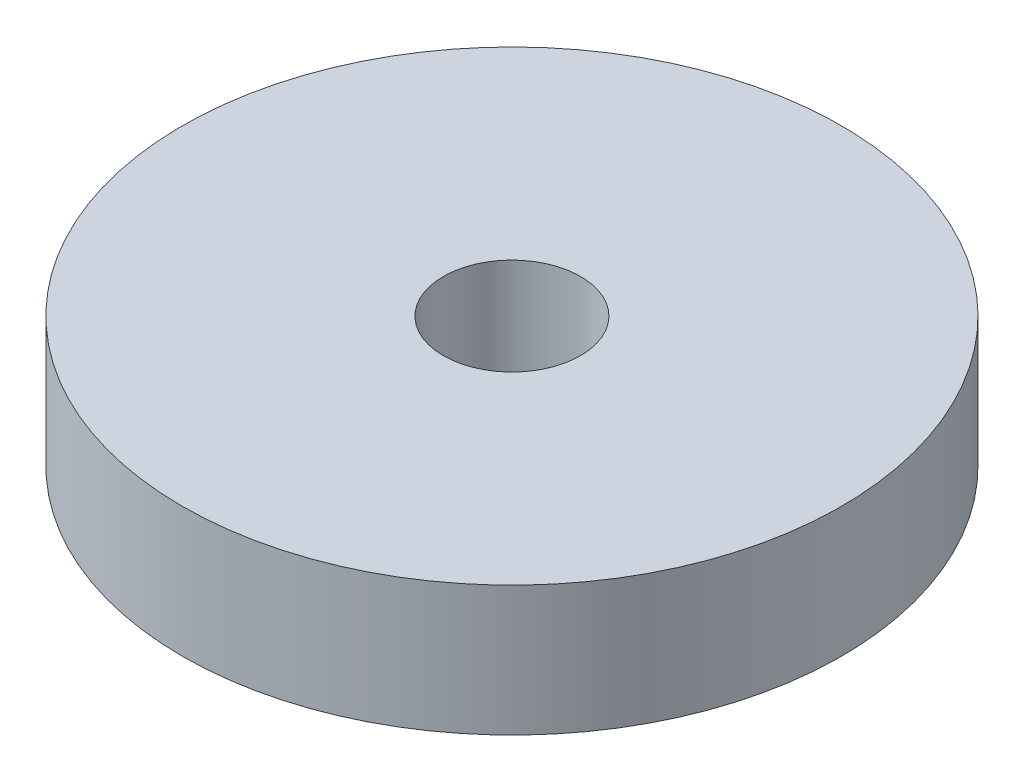
ISO-10303-21;
HEADER;
FILE_DESCRIPTION(('STEP AP214'),'2;1');
FILE_NAME('part.step','',(''),(''),'','','');
FILE_SCHEMA(('AUTOMOTIVE_DESIGN { 1 0 10303 214 1 1 1 1 }'));
ENDSEC;
DATA;
#1=APPLICATION_CONTEXT('core data for automotive mechanical design processes');
#2=APPLICATION_PROTOCOL_DEFINITION('international standard','automotive_design',2000,#1);
#3=PRODUCT_CONTEXT('',#1,'mechanical');
#4=PRODUCT('Part','Part','',(#3));
#5=PRODUCT_RELATED_PRODUCT_CATEGORY('part','',(#4));
#6=PRODUCT_DEFINITION_FORMATION('','',#4);
#7=PRODUCT_DEFINITION_CONTEXT('part definition',#1,'design');
#8=PRODUCT_DEFINITION('design','',#6,#7);
#9=PRODUCT_DEFINITION_SHAPE('','',#8);
#10=(LENGTH_UNIT() NAMED_UNIT(*) SI_UNIT(.MILLI.,.METRE.));
#11=(NAMED_UNIT(*) PLANE_ANGLE_UNIT() SI_UNIT($,.RADIAN.));
#12=(NAMED_UNIT(*) SI_UNIT($,.STERADIAN.) SOLID_ANGLE_UNIT());
#13=UNCERTAINTY_MEASURE_WITH_UNIT(LENGTH_MEASURE(1.E-05),#10,'distance_accuracy_value','');
#14=(GEOMETRIC_REPRESENTATION_CONTEXT(3) GLOBAL_UNCERTAINTY_ASSIGNED_CONTEXT((#13)) GLOBAL_UNIT_ASSIGNED_CONTEXT((#10,
#11,#12)) REPRESENTATION_CONTEXT('',''));
#15=CARTESIAN_POINT('',(0.,0.,0.));
#16=DIRECTION('',(0.,0.,1.));
#17=DIRECTION('',(1.,0.,0.));
#18=AXIS2_PLACEMENT_3D('',#15,#16,#17);
#19=CARTESIAN_POINT('',(0.,3.,0.));
#20=DIRECTION('',(0.,1.,0.));
#21=DIRECTION('',(0.,0.,1.));
#22=AXIS2_PLACEMENT_3D('',#19,#20,#21);
#23=PLANE('',#22);
#24=CARTESIAN_POINT('',(0.,3.,0.));
#25=DIRECTION('',(0.,1.,0.));
#26=DIRECTION('',(0.,0.,1.));
#27=AXIS2_PLACEMENT_3D('',#24,#25,#26);
#28=CIRCLE('',#27,7.61358619534771);
#29=CARTESIAN_POINT('',(0.,3.,7.61358619534771));
#30=VERTEX_POINT('',#29);
#31=EDGE_CURVE('E10',#30,#30,#28,.T.);
#32=ORIENTED_EDGE('',*,*,#31,.T.);
#33=EDGE_LOOP('',(#32));
#34=FACE_BOUND('',#33,.T.);
#35=CARTESIAN_POINT('',(0.,3.,0.));
#36=DIRECTION('',(0.,1.,0.));
#37=DIRECTION('',(0.,0.,1.));
#38=AXIS2_PLACEMENT_3D('',#35,#36,#37);
#39=CIRCLE('',#38,1.585);
#40=CARTESIAN_POINT('',(0.,3.,1.585));
#41=VERTEX_POINT('',#40);
#42=EDGE_CURVE('E42',#41,#41,#39,.T.);
#43=ORIENTED_EDGE('',*,*,#42,.F.);
#44=EDGE_LOOP('',(#43));
#45=FACE_BOUND('',#44,.T.);
#46=ADVANCED_FACE('F31',(#34,#45),#23,.T.);
#47=CARTESIAN_POINT('',(0.,0.,0.));
#48=DIRECTION('',(0.,1.,0.));
#49=DIRECTION('',(0.,0.,1.));
#50=AXIS2_PLACEMENT_3D('',#47,#48,#49);
#51=PLANE('',#50);
#52=CARTESIAN_POINT('',(0.,0.,0.));
#53=DIRECTION('',(0.,1.,0.));
#54=DIRECTION('',(0.,0.,1.));
#55=AXIS2_PLACEMENT_3D('',#52,#53,#54);
#56=CIRCLE('',#55,7.61358619534771);
#57=CARTESIAN_POINT('',(0.,0.,7.61358619534771));
#58=VERTEX_POINT('',#57);
#59=EDGE_CURVE('E35',#58,#58,#56,.T.);
#60=ORIENTED_EDGE('',*,*,#59,.F.);
#61=EDGE_LOOP('',(#60));
#62=FACE_BOUND('',#61,.T.);
#63=CARTESIAN_POINT('',(0.,0.,0.));
#64=DIRECTION('',(0.,1.,0.));
#65=DIRECTION('',(0.,0.,1.));
#66=AXIS2_PLACEMENT_3D('',#63,#64,#65);
#67=CIRCLE('',#66,1.585);
#68=CARTESIAN_POINT('',(0.,0.,1.585));
#69=VERTEX_POINT('',#68);
#70=EDGE_CURVE('E44',#69,#69,#67,.T.);
#71=ORIENTED_EDGE('',*,*,#70,.T.);
#72=EDGE_LOOP('',(#71));
#73=FACE_BOUND('',#72,.T.);
#74=ADVANCED_FACE('F54',(#62,#73),#51,.F.);
#75=CARTESIAN_POINT('',(0.,3.,0.));
#76=DIRECTION('',(0.,-1.,0.));
#77=DIRECTION('',(0.,0.,-1.));
#78=AXIS2_PLACEMENT_3D('',#75,#76,#77);
#79=CYLINDRICAL_SURFACE('',#78,7.61358619534771);
#80=ORIENTED_EDGE('',*,*,#31,.F.);
#81=EDGE_LOOP('',(#80));
#82=FACE_BOUND('',#81,.T.);
#83=ORIENTED_EDGE('',*,*,#59,.T.);
#84=EDGE_LOOP('',(#83));
#85=FACE_BOUND('',#84,.T.);
#86=ADVANCED_FACE('F33',(#82,#85),#79,.T.);
#87=CARTESIAN_POINT('',(0.,3.,0.));
#88=DIRECTION('',(0.,-1.,0.));
#89=DIRECTION('',(0.,0.,-1.));
#90=AXIS2_PLACEMENT_3D('',#87,#88,#89);
#91=CYLINDRICAL_SURFACE('',#90,1.585);
#92=ORIENTED_EDGE('',*,*,#42,.T.);
#93=EDGE_LOOP('',(#92));
#94=FACE_BOUND('',#93,.T.);
#95=ORIENTED_EDGE('',*,*,#70,.F.);
#96=EDGE_LOOP('',(#95));
#97=FACE_BOUND('',#96,.T.);
#98=ADVANCED_FACE('F50',(#94,#97),#91,.F.);
#99=CLOSED_SHELL('',(#46,#74,#86,#98));
#100=MANIFOLD_SOLID_BREP('B2',#99);
#101=ADVANCED_BREP_SHAPE_REPRESENTATION('',(#18,#100),#14);
#102=SHAPE_DEFINITION_REPRESENTATION(#9,#101);
ENDSEC;
END-ISO-10303-21;
